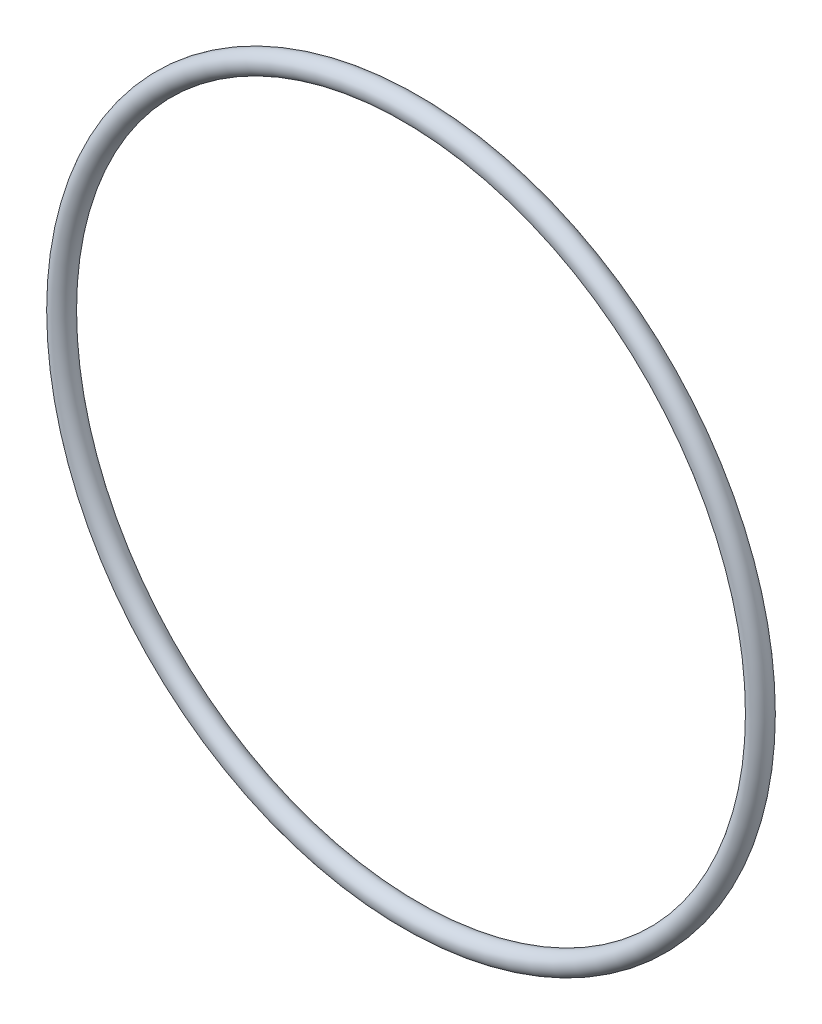
ISO-10303-21;
HEADER;
FILE_DESCRIPTION(('STEP AP214'),'2;1');
FILE_NAME('part.step','',(''),(''),'','','');
FILE_SCHEMA(('AUTOMOTIVE_DESIGN { 1 0 10303 214 1 1 1 1 }'));
ENDSEC;
DATA;
#1=APPLICATION_CONTEXT('core data for automotive mechanical design processes');
#2=APPLICATION_PROTOCOL_DEFINITION('international standard','automotive_design',2000,#1);
#3=PRODUCT_CONTEXT('',#1,'mechanical');
#4=PRODUCT('Part','Part','',(#3));
#5=PRODUCT_RELATED_PRODUCT_CATEGORY('part','',(#4));
#6=PRODUCT_DEFINITION_FORMATION('','',#4);
#7=PRODUCT_DEFINITION_CONTEXT('part definition',#1,'design');
#8=PRODUCT_DEFINITION('design','',#6,#7);
#9=PRODUCT_DEFINITION_SHAPE('','',#8);
#10=(LENGTH_UNIT() NAMED_UNIT(*) SI_UNIT(.MILLI.,.METRE.));
#11=(NAMED_UNIT(*) PLANE_ANGLE_UNIT() SI_UNIT($,.RADIAN.));
#12=(NAMED_UNIT(*) SI_UNIT($,.STERADIAN.) SOLID_ANGLE_UNIT());
#13=UNCERTAINTY_MEASURE_WITH_UNIT(LENGTH_MEASURE(1.E-05),#10,'distance_accuracy_value','');
#14=(GEOMETRIC_REPRESENTATION_CONTEXT(3) GLOBAL_UNCERTAINTY_ASSIGNED_CONTEXT((#13)) GLOBAL_UNIT_ASSIGNED_CONTEXT((#10,
#11,#12)) REPRESENTATION_CONTEXT('',''));
#15=CARTESIAN_POINT('',(0.,0.,0.));
#16=DIRECTION('',(0.,0.,1.));
#17=DIRECTION('',(1.,0.,0.));
#18=AXIS2_PLACEMENT_3D('',#15,#16,#17);
#19=CARTESIAN_POINT('',(0.,0.,0.));
#20=DIRECTION('',(0.,0.,1.));
#21=DIRECTION('',(1.,0.,0.));
#22=AXIS2_PLACEMENT_3D('',#19,#20,#21);
#23=TOROIDAL_SURFACE('',#22,88.0745,2.667);
#24=CARTESIAN_POINT('',(90.7415,0.,0.));
#25=VERTEX_POINT('',#24);
#26=VERTEX_LOOP('',#25);
#27=FACE_BOUND('',#26,.T.);
#28=ADVANCED_FACE('F33',(#27),#23,.T.);
#29=CLOSED_SHELL('',(#28));
#30=MANIFOLD_SOLID_BREP('B2',#29);
#31=ADVANCED_BREP_SHAPE_REPRESENTATION('',(#18,#30),#14);
#32=SHAPE_DEFINITION_REPRESENTATION(#9,#31);
ENDSEC;
END-ISO-10303-21;
